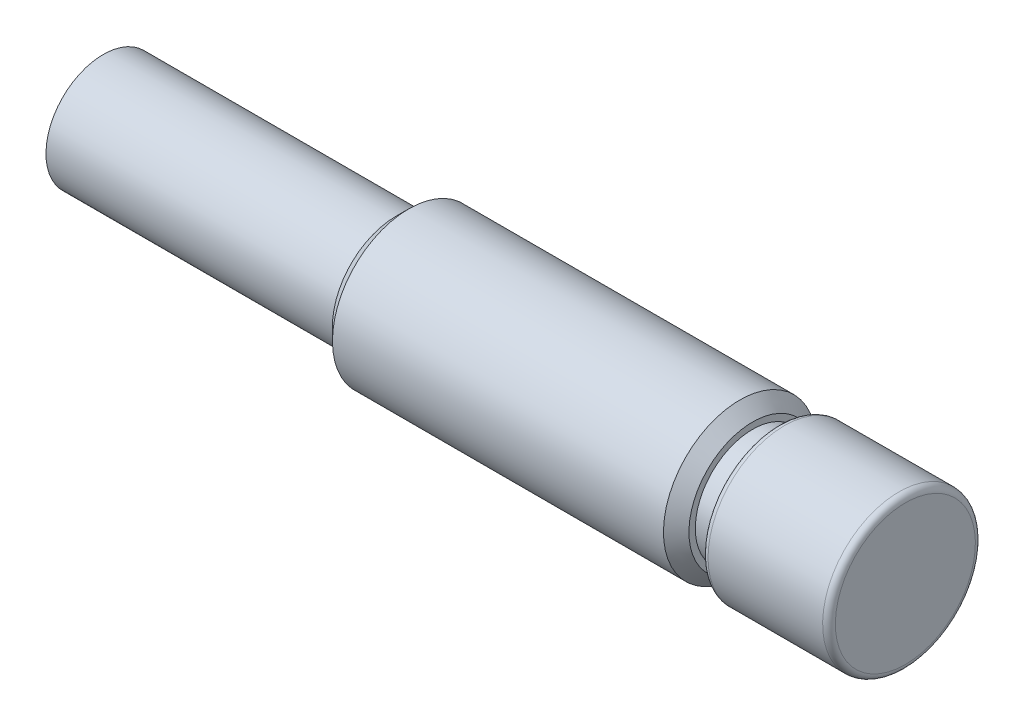
ISO-10303-21;
HEADER;
FILE_DESCRIPTION(('STEP AP214'),'2;1');
FILE_NAME('part.step','',(''),(''),'','','');
FILE_SCHEMA(('AUTOMOTIVE_DESIGN { 1 0 10303 214 1 1 1 1 }'));
ENDSEC;
DATA;
#1=APPLICATION_CONTEXT('core data for automotive mechanical design processes');
#2=APPLICATION_PROTOCOL_DEFINITION('international standard','automotive_design',2000,#1);
#3=PRODUCT_CONTEXT('',#1,'mechanical');
#4=PRODUCT('Part','Part','',(#3));
#5=PRODUCT_RELATED_PRODUCT_CATEGORY('part','',(#4));
#6=PRODUCT_DEFINITION_FORMATION('','',#4);
#7=PRODUCT_DEFINITION_CONTEXT('part definition',#1,'design');
#8=PRODUCT_DEFINITION('design','',#6,#7);
#9=PRODUCT_DEFINITION_SHAPE('','',#8);
#10=(LENGTH_UNIT() NAMED_UNIT(*) SI_UNIT(.MILLI.,.METRE.));
#11=(NAMED_UNIT(*) PLANE_ANGLE_UNIT() SI_UNIT($,.RADIAN.));
#12=(NAMED_UNIT(*) SI_UNIT($,.STERADIAN.) SOLID_ANGLE_UNIT());
#13=UNCERTAINTY_MEASURE_WITH_UNIT(LENGTH_MEASURE(1.E-05),#10,'distance_accuracy_value','');
#14=(GEOMETRIC_REPRESENTATION_CONTEXT(3) GLOBAL_UNCERTAINTY_ASSIGNED_CONTEXT((#13)) GLOBAL_UNIT_ASSIGNED_CONTEXT((#10,
#11,#12)) REPRESENTATION_CONTEXT('',''));
#15=CARTESIAN_POINT('',(0.,0.,0.));
#16=DIRECTION('',(0.,0.,1.));
#17=DIRECTION('',(1.,0.,0.));
#18=AXIS2_PLACEMENT_3D('',#15,#16,#17);
#19=CARTESIAN_POINT('',(63.,0.,0.));
#20=DIRECTION('',(-1.,0.,0.));
#21=DIRECTION('',(0.,-1.,0.));
#22=AXIS2_PLACEMENT_3D('',#19,#20,#21);
#23=PLANE('',#22);
#24=CARTESIAN_POINT('',(63.,0.,0.));
#25=DIRECTION('',(-1.,0.,0.));
#26=DIRECTION('',(0.,-1.,0.));
#27=AXIS2_PLACEMENT_3D('',#24,#25,#26);
#28=CIRCLE('',#27,5.5);
#29=CARTESIAN_POINT('',(63.,-5.5,0.));
#30=VERTEX_POINT('',#29);
#31=EDGE_CURVE('E90',#30,#30,#28,.F.);
#32=ORIENTED_EDGE('',*,*,#31,.T.);
#33=EDGE_LOOP('',(#32));
#34=FACE_BOUND('',#33,.T.);
#35=ADVANCED_FACE('F50',(#34),#23,.F.);
#36=CARTESIAN_POINT('',(3.39980647955215,0.,0.));
#37=DIRECTION('',(-1.,0.,0.));
#38=DIRECTION('',(0.,-1.,0.));
#39=AXIS2_PLACEMENT_3D('',#36,#37,#38);
#40=CYLINDRICAL_SURFACE('',#39,6.);
#41=CARTESIAN_POINT('',(62.5,0.,0.));
#42=DIRECTION('',(-1.,0.,0.));
#43=DIRECTION('',(0.,-1.,0.));
#44=AXIS2_PLACEMENT_3D('',#41,#42,#43);
#45=CIRCLE('',#44,6.);
#46=CARTESIAN_POINT('',(62.5,-6.,0.));
#47=VERTEX_POINT('',#46);
#48=EDGE_CURVE('E87',#47,#47,#45,.T.);
#49=ORIENTED_EDGE('',*,*,#48,.T.);
#50=EDGE_LOOP('',(#49));
#51=FACE_BOUND('',#50,.T.);
#52=CARTESIAN_POINT('',(53.5,0.,0.));
#53=DIRECTION('',(1.,0.,0.));
#54=DIRECTION('',(0.,1.,0.));
#55=AXIS2_PLACEMENT_3D('',#52,#53,#54);
#56=CIRCLE('',#55,6.);
#57=CARTESIAN_POINT('',(53.5,6.,0.));
#58=VERTEX_POINT('',#57);
#59=EDGE_CURVE('E84',#58,#58,#56,.T.);
#60=ORIENTED_EDGE('',*,*,#59,.T.);
#61=EDGE_LOOP('',(#60));
#62=FACE_BOUND('',#61,.T.);
#63=ADVANCED_FACE('F139',(#51,#62),#40,.T.);
#64=CARTESIAN_POINT('',(53.,6.00000000000001,0.));
#65=DIRECTION('',(1.,0.,0.));
#66=DIRECTION('',(0.,1.,0.));
#67=AXIS2_PLACEMENT_3D('',#64,#65,#66);
#68=PLANE('',#67);
#69=CARTESIAN_POINT('',(53.,0.,0.));
#70=DIRECTION('',(1.,0.,0.));
#71=DIRECTION('',(0.,1.,0.));
#72=AXIS2_PLACEMENT_3D('',#69,#70,#71);
#73=CIRCLE('',#72,5.5);
#74=CARTESIAN_POINT('',(53.,5.5,0.));
#75=VERTEX_POINT('',#74);
#76=EDGE_CURVE('E93',#75,#75,#73,.F.);
#77=ORIENTED_EDGE('',*,*,#76,.T.);
#78=EDGE_LOOP('',(#77));
#79=FACE_BOUND('',#78,.T.);
#80=CARTESIAN_POINT('',(53.,0.,0.));
#81=DIRECTION('',(-1.,0.,0.));
#82=DIRECTION('',(0.,-1.,0.));
#83=AXIS2_PLACEMENT_3D('',#80,#81,#82);
#84=CIRCLE('',#83,4.50000000000001);
#85=CARTESIAN_POINT('',(53.,-4.50000000000001,0.));
#86=VERTEX_POINT('',#85);
#87=EDGE_CURVE('E81',#86,#86,#84,.T.);
#88=ORIENTED_EDGE('',*,*,#87,.F.);
#89=EDGE_LOOP('',(#88));
#90=FACE_BOUND('',#89,.T.);
#91=ADVANCED_FACE('F145',(#79,#90),#68,.F.);
#92=CARTESIAN_POINT('',(3.39980647955215,0.,0.));
#93=DIRECTION('',(-1.,0.,0.));
#94=DIRECTION('',(0.,-1.,0.));
#95=AXIS2_PLACEMENT_3D('',#92,#93,#94);
#96=CYLINDRICAL_SURFACE('',#95,4.50000000000001);
#97=CARTESIAN_POINT('',(51.,0.,0.));
#98=DIRECTION('',(-1.,0.,0.));
#99=DIRECTION('',(0.,-1.,0.));
#100=AXIS2_PLACEMENT_3D('',#97,#98,#99);
#101=CIRCLE('',#100,4.5);
#102=CARTESIAN_POINT('',(51.,-4.50000000000001,0.));
#103=VERTEX_POINT('',#102);
#104=EDGE_CURVE('E78',#103,#103,#101,.T.);
#105=ORIENTED_EDGE('',*,*,#104,.F.);
#106=EDGE_LOOP('',(#105));
#107=FACE_BOUND('',#106,.T.);
#108=ORIENTED_EDGE('',*,*,#87,.T.);
#109=EDGE_LOOP('',(#108));
#110=FACE_BOUND('',#109,.T.);
#111=ADVANCED_FACE('F163',(#107,#110),#96,.T.);
#112=CARTESIAN_POINT('',(51.,4.5,0.));
#113=DIRECTION('',(-1.,0.,0.));
#114=DIRECTION('',(0.,-1.,0.));
#115=AXIS2_PLACEMENT_3D('',#112,#113,#114);
#116=PLANE('',#115);
#117=CARTESIAN_POINT('',(51.,0.,0.));
#118=DIRECTION('',(-1.,0.,0.));
#119=DIRECTION('',(0.,-1.,0.));
#120=AXIS2_PLACEMENT_3D('',#117,#118,#119);
#121=CIRCLE('',#120,4.99999999999997);
#122=CARTESIAN_POINT('',(51.,-4.99999999999997,0.));
#123=VERTEX_POINT('',#122);
#124=EDGE_CURVE('E57',#123,#123,#121,.F.);
#125=ORIENTED_EDGE('',*,*,#124,.T.);
#126=EDGE_LOOP('',(#125));
#127=FACE_BOUND('',#126,.T.);
#128=ORIENTED_EDGE('',*,*,#104,.T.);
#129=EDGE_LOOP('',(#128));
#130=FACE_BOUND('',#129,.T.);
#131=ADVANCED_FACE('F104',(#127,#130),#116,.F.);
#132=CARTESIAN_POINT('',(3.39980647955215,0.,0.));
#133=DIRECTION('',(-1.,0.,0.));
#134=DIRECTION('',(0.,-1.,0.));
#135=AXIS2_PLACEMENT_3D('',#132,#133,#134);
#136=CYLINDRICAL_SURFACE('',#135,6.);
#137=CARTESIAN_POINT('',(50.,0.,0.));
#138=DIRECTION('',(-1.,0.,0.));
#139=DIRECTION('',(0.,-1.,0.));
#140=AXIS2_PLACEMENT_3D('',#137,#138,#139);
#141=CIRCLE('',#140,6.);
#142=CARTESIAN_POINT('',(50.,-6.,0.));
#143=VERTEX_POINT('',#142);
#144=EDGE_CURVE('E99',#143,#143,#141,.T.);
#145=ORIENTED_EDGE('',*,*,#144,.T.);
#146=EDGE_LOOP('',(#145));
#147=FACE_BOUND('',#146,.T.);
#148=CARTESIAN_POINT('',(24.,0.,0.));
#149=DIRECTION('',(1.,0.,0.));
#150=DIRECTION('',(0.,1.,0.));
#151=AXIS2_PLACEMENT_3D('',#148,#149,#150);
#152=CIRCLE('',#151,6.);
#153=CARTESIAN_POINT('',(24.,6.,0.));
#154=VERTEX_POINT('',#153);
#155=EDGE_CURVE('E96',#154,#154,#152,.T.);
#156=ORIENTED_EDGE('',*,*,#155,.T.);
#157=EDGE_LOOP('',(#156));
#158=FACE_BOUND('',#157,.T.);
#159=ADVANCED_FACE('F113',(#147,#158),#136,.T.);
#160=CARTESIAN_POINT('',(23.,6.,0.));
#161=DIRECTION('',(1.,0.,0.));
#162=DIRECTION('',(0.,1.,0.));
#163=AXIS2_PLACEMENT_3D('',#160,#161,#162);
#164=PLANE('',#163);
#165=CARTESIAN_POINT('',(23.,0.,0.));
#166=DIRECTION('',(1.,0.,0.));
#167=DIRECTION('',(0.,1.,0.));
#168=AXIS2_PLACEMENT_3D('',#165,#166,#167);
#169=CIRCLE('',#168,5.);
#170=CARTESIAN_POINT('',(23.,5.00000000000001,0.));
#171=VERTEX_POINT('',#170);
#172=EDGE_CURVE('E13',#171,#171,#169,.F.);
#173=ORIENTED_EDGE('',*,*,#172,.T.);
#174=EDGE_LOOP('',(#173));
#175=FACE_BOUND('',#174,.T.);
#176=CARTESIAN_POINT('',(23.,0.,0.));
#177=DIRECTION('',(-1.,0.,0.));
#178=DIRECTION('',(0.,-1.,0.));
#179=AXIS2_PLACEMENT_3D('',#176,#177,#178);
#180=CIRCLE('',#179,4.5);
#181=CARTESIAN_POINT('',(23.,-4.5,0.));
#182=VERTEX_POINT('',#181);
#183=EDGE_CURVE('E73',#182,#182,#180,.T.);
#184=ORIENTED_EDGE('',*,*,#183,.F.);
#185=EDGE_LOOP('',(#184));
#186=FACE_BOUND('',#185,.T.);
#187=ADVANCED_FACE('F116',(#175,#186),#164,.F.);
#188=CARTESIAN_POINT('',(3.39980647955215,0.,0.));
#189=DIRECTION('',(-1.,0.,0.));
#190=DIRECTION('',(0.,-1.,0.));
#191=AXIS2_PLACEMENT_3D('',#188,#189,#190);
#192=CYLINDRICAL_SURFACE('',#191,4.5);
#193=CARTESIAN_POINT('',(0.,0.,0.));
#194=DIRECTION('',(-1.,0.,0.));
#195=DIRECTION('',(0.,-1.,0.));
#196=AXIS2_PLACEMENT_3D('',#193,#194,#195);
#197=CIRCLE('',#196,4.5);
#198=CARTESIAN_POINT('',(0.,-4.5,0.));
#199=VERTEX_POINT('',#198);
#200=EDGE_CURVE('E70',#199,#199,#197,.T.);
#201=ORIENTED_EDGE('',*,*,#200,.F.);
#202=EDGE_LOOP('',(#201));
#203=FACE_BOUND('',#202,.T.);
#204=ORIENTED_EDGE('',*,*,#183,.T.);
#205=EDGE_LOOP('',(#204));
#206=FACE_BOUND('',#205,.T.);
#207=ADVANCED_FACE('F126',(#203,#206),#192,.T.);
#208=CARTESIAN_POINT('',(0.,4.5,0.));
#209=DIRECTION('',(1.,0.,0.));
#210=DIRECTION('',(0.,1.,0.));
#211=AXIS2_PLACEMENT_3D('',#208,#209,#210);
#212=PLANE('',#211);
#213=CARTESIAN_POINT('',(0.,0.,0.));
#214=DIRECTION('',(-1.,0.,0.));
#215=DIRECTION('',(0.,-1.,0.));
#216=AXIS2_PLACEMENT_3D('',#213,#214,#215);
#217=CIRCLE('',#216,4.35641669844335);
#218=CARTESIAN_POINT('',(0.,-4.35641669844335,0.));
#219=VERTEX_POINT('',#218);
#220=EDGE_CURVE('E68',#219,#219,#217,.T.);
#221=ORIENTED_EDGE('',*,*,#220,.F.);
#222=EDGE_LOOP('',(#221));
#223=FACE_BOUND('',#222,.T.);
#224=ORIENTED_EDGE('',*,*,#200,.T.);
#225=EDGE_LOOP('',(#224));
#226=FACE_BOUND('',#225,.T.);
#227=ADVANCED_FACE('F64',(#223,#226),#212,.F.);
#228=CARTESIAN_POINT('',(0.,0.,0.));
#229=DIRECTION('',(-1.,0.,0.));
#230=DIRECTION('',(0.,-1.,0.));
#231=AXIS2_PLACEMENT_3D('',#228,#229,#230);
#232=CONICAL_SURFACE('',#231,4.35641669844335,0.90811298581338);
#233=CARTESIAN_POINT('',(3.39980647955215,0.,0.));
#234=VERTEX_POINT('',#233);
#235=VERTEX_LOOP('',#234);
#236=FACE_BOUND('',#235,.T.);
#237=ORIENTED_EDGE('',*,*,#220,.T.);
#238=EDGE_LOOP('',(#237));
#239=FACE_BOUND('',#238,.T.);
#240=ADVANCED_FACE('F60',(#236,#239),#232,.F.);
#241=CARTESIAN_POINT('',(62.5,0.,0.));
#242=DIRECTION('',(-1.,0.,0.));
#243=DIRECTION('',(0.,-1.,0.));
#244=AXIS2_PLACEMENT_3D('',#241,#242,#243);
#245=TOROIDAL_SURFACE('',#244,5.5,0.5);
#246=ORIENTED_EDGE('',*,*,#31,.F.);
#247=EDGE_LOOP('',(#246));
#248=FACE_BOUND('',#247,.T.);
#249=ORIENTED_EDGE('',*,*,#48,.F.);
#250=EDGE_LOOP('',(#249));
#251=FACE_BOUND('',#250,.T.);
#252=ADVANCED_FACE('F63',(#248,#251),#245,.T.);
#253=CARTESIAN_POINT('',(53.5,0.,0.));
#254=DIRECTION('',(1.,0.,0.));
#255=DIRECTION('',(0.,1.,0.));
#256=AXIS2_PLACEMENT_3D('',#253,#254,#255);
#257=TOROIDAL_SURFACE('',#256,5.5,0.5);
#258=ORIENTED_EDGE('',*,*,#59,.F.);
#259=EDGE_LOOP('',(#258));
#260=FACE_BOUND('',#259,.T.);
#261=ORIENTED_EDGE('',*,*,#76,.F.);
#262=EDGE_LOOP('',(#261));
#263=FACE_BOUND('',#262,.T.);
#264=ADVANCED_FACE('F110',(#260,#263),#257,.T.);
#265=CARTESIAN_POINT('',(50.,0.,0.));
#266=DIRECTION('',(-1.,0.,0.));
#267=DIRECTION('',(0.,-1.,0.));
#268=AXIS2_PLACEMENT_3D('',#265,#266,#267);
#269=CONICAL_SURFACE('',#268,6.,0.785398163397459);
#270=ORIENTED_EDGE('',*,*,#124,.F.);
#271=EDGE_LOOP('',(#270));
#272=FACE_BOUND('',#271,.T.);
#273=ORIENTED_EDGE('',*,*,#144,.F.);
#274=EDGE_LOOP('',(#273));
#275=FACE_BOUND('',#274,.T.);
#276=ADVANCED_FACE('F107',(#272,#275),#269,.T.);
#277=CARTESIAN_POINT('',(23.,0.,0.));
#278=DIRECTION('',(1.,0.,0.));
#279=DIRECTION('',(0.,1.,0.));
#280=AXIS2_PLACEMENT_3D('',#277,#278,#279);
#281=CONICAL_SURFACE('',#280,5.,0.785398163397448);
#282=ORIENTED_EDGE('',*,*,#155,.F.);
#283=EDGE_LOOP('',(#282));
#284=FACE_BOUND('',#283,.T.);
#285=ORIENTED_EDGE('',*,*,#172,.F.);
#286=EDGE_LOOP('',(#285));
#287=FACE_BOUND('',#286,.T.);
#288=ADVANCED_FACE('F52',(#284,#287),#281,.T.);
#289=CLOSED_SHELL('',(#35,#63,#91,#111,#131,#159,#187,#207,#227,#240,#252,#264,#276,#288));
#290=MANIFOLD_SOLID_BREP('B2',#289);
#291=ADVANCED_BREP_SHAPE_REPRESENTATION('',(#18,#290),#14);
#292=SHAPE_DEFINITION_REPRESENTATION(#9,#291);
ENDSEC;
END-ISO-10303-21;
